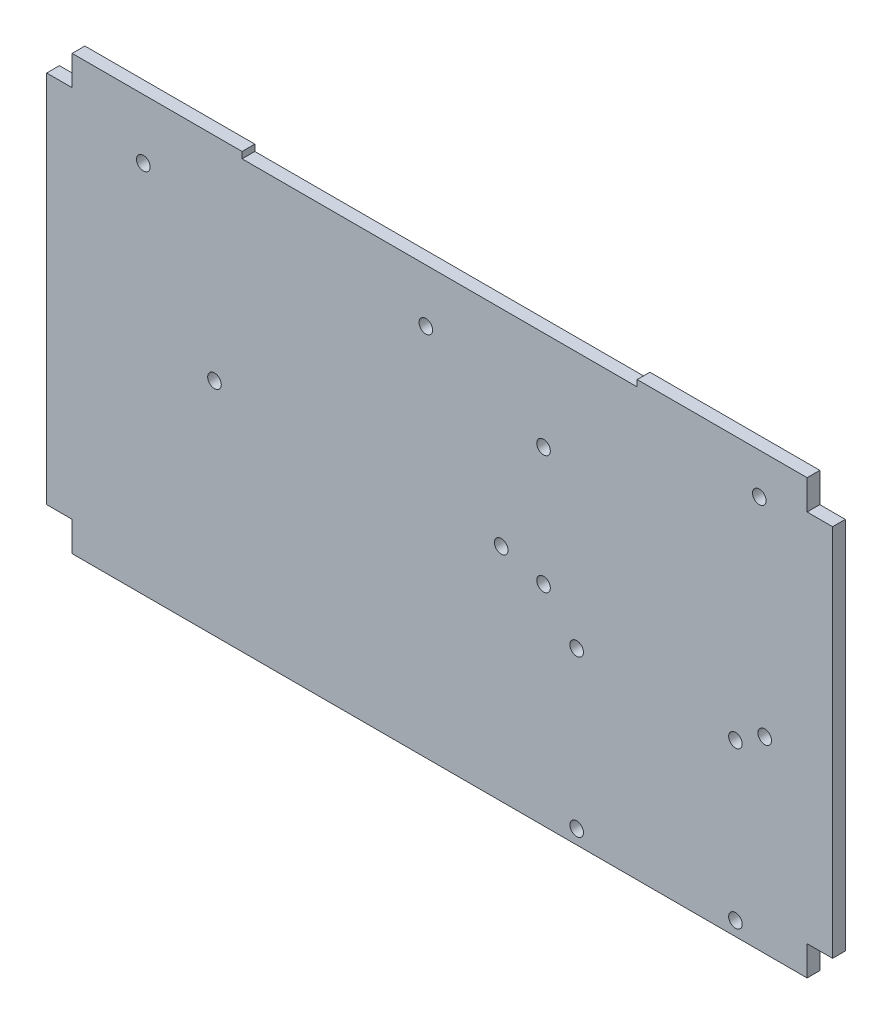
ISO-10303-21;
HEADER;
FILE_DESCRIPTION(('STEP AP214'),'2;1');
FILE_NAME('part.step','',(''),(''),'','','');
FILE_SCHEMA(('AUTOMOTIVE_DESIGN { 1 0 10303 214 1 1 1 1 }'));
ENDSEC;
DATA;
#1=APPLICATION_CONTEXT('core data for automotive mechanical design processes');
#2=APPLICATION_PROTOCOL_DEFINITION('international standard','automotive_design',2000,#1);
#3=PRODUCT_CONTEXT('',#1,'mechanical');
#4=PRODUCT('Part','Part','',(#3));
#5=PRODUCT_RELATED_PRODUCT_CATEGORY('part','',(#4));
#6=PRODUCT_DEFINITION_FORMATION('','',#4);
#7=PRODUCT_DEFINITION_CONTEXT('part definition',#1,'design');
#8=PRODUCT_DEFINITION('design','',#6,#7);
#9=PRODUCT_DEFINITION_SHAPE('','',#8);
#10=(LENGTH_UNIT() NAMED_UNIT(*) SI_UNIT(.MILLI.,.METRE.));
#11=(NAMED_UNIT(*) PLANE_ANGLE_UNIT() SI_UNIT($,.RADIAN.));
#12=(NAMED_UNIT(*) SI_UNIT($,.STERADIAN.) SOLID_ANGLE_UNIT());
#13=UNCERTAINTY_MEASURE_WITH_UNIT(LENGTH_MEASURE(1.E-05),#10,'distance_accuracy_value','');
#14=(GEOMETRIC_REPRESENTATION_CONTEXT(3) GLOBAL_UNCERTAINTY_ASSIGNED_CONTEXT((#13)) GLOBAL_UNIT_ASSIGNED_CONTEXT((#10,
#11,#12)) REPRESENTATION_CONTEXT('',''));
#15=CARTESIAN_POINT('',(0.,0.,0.));
#16=DIRECTION('',(0.,0.,1.));
#17=DIRECTION('',(1.,0.,0.));
#18=AXIS2_PLACEMENT_3D('',#15,#16,#17);
#19=CARTESIAN_POINT('',(92.5,51.,3.));
#20=DIRECTION('',(0.,-1.,0.));
#21=DIRECTION('',(1.,0.,0.));
#22=AXIS2_PLACEMENT_3D('',#19,#20,#21);
#23=PLANE('',#22);
#24=DIRECTION('',(0.,0.,-1.));
#25=VECTOR('',#24,1.);
#26=CARTESIAN_POINT('',(-46.5,51.,3.));
#27=LINE('',#26,#25);
#28=CARTESIAN_POINT('',(-46.5,51.,3.));
#29=VERTEX_POINT('',#28);
#30=CARTESIAN_POINT('',(-46.5,51.,0.));
#31=VERTEX_POINT('',#30);
#32=EDGE_CURVE('E484',#29,#31,#27,.T.);
#33=ORIENTED_EDGE('',*,*,#32,.T.);
#34=DIRECTION('',(-1.,0.,0.));
#35=VECTOR('',#34,1.);
#36=CARTESIAN_POINT('',(92.5,51.,0.));
#37=LINE('',#36,#35);
#38=CARTESIAN_POINT('',(-86.5,51.,0.));
#39=VERTEX_POINT('',#38);
#40=EDGE_CURVE('E199',#31,#39,#37,.T.);
#41=ORIENTED_EDGE('',*,*,#40,.T.);
#42=DIRECTION('',(0.,0.,-1.));
#43=VECTOR('',#42,1.);
#44=CARTESIAN_POINT('',(-86.5,51.,3.));
#45=LINE('',#44,#43);
#46=CARTESIAN_POINT('',(-86.5,51.,3.));
#47=VERTEX_POINT('',#46);
#48=EDGE_CURVE('E288',#47,#39,#45,.T.);
#49=ORIENTED_EDGE('',*,*,#48,.F.);
#50=DIRECTION('',(-1.,0.,0.));
#51=VECTOR('',#50,1.);
#52=CARTESIAN_POINT('',(92.5,51.,3.));
#53=LINE('',#52,#51);
#54=EDGE_CURVE('E244',#29,#47,#53,.T.);
#55=ORIENTED_EDGE('',*,*,#54,.F.);
#56=EDGE_LOOP('',(#33,#41,#49,#55));
#57=FACE_BOUND('',#56,.T.);
#58=ADVANCED_FACE('F37',(#57),#23,.F.);
#59=CARTESIAN_POINT('',(89.75,-47.5,0.));
#60=DIRECTION('',(0.,0.,1.));
#61=DIRECTION('',(1.,0.,0.));
#62=AXIS2_PLACEMENT_3D('',#59,#60,#61);
#63=PLANE('',#62);
#64=DIRECTION('',(-1.,0.,0.));
#65=VECTOR('',#64,1.);
#66=CARTESIAN_POINT('',(46.5,49.5,0.));
#67=LINE('',#66,#65);
#68=CARTESIAN_POINT('',(46.5,49.5,0.));
#69=VERTEX_POINT('',#68);
#70=CARTESIAN_POINT('',(-46.5,49.5,0.));
#71=VERTEX_POINT('',#70);
#72=EDGE_CURVE('E174',#69,#71,#67,.T.);
#73=ORIENTED_EDGE('',*,*,#72,.F.);
#74=DIRECTION('',(0.,-1.,0.));
#75=VECTOR('',#74,1.);
#76=CARTESIAN_POINT('',(46.5,51.,0.));
#77=LINE('',#76,#75);
#78=CARTESIAN_POINT('',(46.5,51.,0.));
#79=VERTEX_POINT('',#78);
#80=EDGE_CURVE('E155',#79,#69,#77,.T.);
#81=ORIENTED_EDGE('',*,*,#80,.F.);
#82=CARTESIAN_POINT('',(86.5,51.,0.));
#83=VERTEX_POINT('',#82);
#84=EDGE_CURVE('E193',#83,#79,#37,.T.);
#85=ORIENTED_EDGE('',*,*,#84,.F.);
#86=DIRECTION('',(0.,1.,0.));
#87=VECTOR('',#86,1.);
#88=CARTESIAN_POINT('',(86.5,51.,0.));
#89=LINE('',#88,#87);
#90=CARTESIAN_POINT('',(86.5,44.,0.));
#91=VERTEX_POINT('',#90);
#92=EDGE_CURVE('E321',#91,#83,#89,.T.);
#93=ORIENTED_EDGE('',*,*,#92,.F.);
#94=DIRECTION('',(-1.,0.,0.));
#95=VECTOR('',#94,1.);
#96=CARTESIAN_POINT('',(93.,44.,0.));
#97=LINE('',#96,#95);
#98=CARTESIAN_POINT('',(92.5,44.,0.));
#99=VERTEX_POINT('',#98);
#100=EDGE_CURVE('E318',#99,#91,#97,.T.);
#101=ORIENTED_EDGE('',*,*,#100,.F.);
#102=DIRECTION('',(0.,1.,0.));
#103=VECTOR('',#102,1.);
#104=CARTESIAN_POINT('',(92.5,-46.3010421191718,0.));
#105=LINE('',#104,#103);
#106=CARTESIAN_POINT('',(92.5,-44.,0.));
#107=VERTEX_POINT('',#106);
#108=EDGE_CURVE('E200',#107,#99,#105,.T.);
#109=ORIENTED_EDGE('',*,*,#108,.F.);
#110=DIRECTION('',(1.,0.,0.));
#111=VECTOR('',#110,1.);
#112=CARTESIAN_POINT('',(93.,-44.,0.));
#113=LINE('',#112,#111);
#114=CARTESIAN_POINT('',(86.5,-44.,0.));
#115=VERTEX_POINT('',#114);
#116=EDGE_CURVE('E304',#115,#107,#113,.T.);
#117=ORIENTED_EDGE('',*,*,#116,.F.);
#118=DIRECTION('',(0.,1.,0.));
#119=VECTOR('',#118,1.);
#120=CARTESIAN_POINT('',(86.5,-51.,0.));
#121=LINE('',#120,#119);
#122=CARTESIAN_POINT('',(86.5,-51.,0.));
#123=VERTEX_POINT('',#122);
#124=EDGE_CURVE('E307',#123,#115,#121,.T.);
#125=ORIENTED_EDGE('',*,*,#124,.F.);
#126=DIRECTION('',(1.,0.,0.));
#127=VECTOR('',#126,1.);
#128=CARTESIAN_POINT('',(-92.5,-51.,0.));
#129=LINE('',#128,#127);
#130=CARTESIAN_POINT('',(-86.5,-51.,0.));
#131=VERTEX_POINT('',#130);
#132=EDGE_CURVE('E238',#131,#123,#129,.T.);
#133=ORIENTED_EDGE('',*,*,#132,.F.);
#134=DIRECTION('',(0.,-1.,0.));
#135=VECTOR('',#134,1.);
#136=CARTESIAN_POINT('',(-86.5,-51.,0.));
#137=LINE('',#136,#135);
#138=CARTESIAN_POINT('',(-86.5,-44.,0.));
#139=VERTEX_POINT('',#138);
#140=EDGE_CURVE('E263',#139,#131,#137,.T.);
#141=ORIENTED_EDGE('',*,*,#140,.F.);
#142=DIRECTION('',(1.,0.,0.));
#143=VECTOR('',#142,1.);
#144=CARTESIAN_POINT('',(-93.,-44.,0.));
#145=LINE('',#144,#143);
#146=CARTESIAN_POINT('',(-92.5,-44.,0.));
#147=VERTEX_POINT('',#146);
#148=EDGE_CURVE('E267',#147,#139,#145,.T.);
#149=ORIENTED_EDGE('',*,*,#148,.F.);
#150=DIRECTION('',(0.,-1.,0.));
#151=VECTOR('',#150,1.);
#152=CARTESIAN_POINT('',(-92.5,46.3010421191718,0.));
#153=LINE('',#152,#151);
#154=CARTESIAN_POINT('',(-92.5,44.,0.));
#155=VERTEX_POINT('',#154);
#156=EDGE_CURVE('E198',#155,#147,#153,.T.);
#157=ORIENTED_EDGE('',*,*,#156,.F.);
#158=DIRECTION('',(-1.,0.,0.));
#159=VECTOR('',#158,1.);
#160=CARTESIAN_POINT('',(-93.,44.,0.));
#161=LINE('',#160,#159);
#162=CARTESIAN_POINT('',(-86.5,44.,0.));
#163=VERTEX_POINT('',#162);
#164=EDGE_CURVE('E276',#163,#155,#161,.T.);
#165=ORIENTED_EDGE('',*,*,#164,.F.);
#166=DIRECTION('',(0.,-1.,0.));
#167=VECTOR('',#166,1.);
#168=CARTESIAN_POINT('',(-86.5,51.,0.));
#169=LINE('',#168,#167);
#170=EDGE_CURVE('E280',#39,#163,#169,.T.);
#171=ORIENTED_EDGE('',*,*,#170,.F.);
#172=ORIENTED_EDGE('',*,*,#40,.F.);
#173=DIRECTION('',(0.,-1.,0.));
#174=VECTOR('',#173,1.);
#175=CARTESIAN_POINT('',(-46.5,51.,0.));
#176=LINE('',#175,#174);
#177=EDGE_CURVE('E171',#31,#71,#176,.T.);
#178=ORIENTED_EDGE('',*,*,#177,.T.);
#179=EDGE_LOOP('',(#73,#81,#85,#93,#101,#109,#117,#125,#133,#141,#149,#157,#165,#171,#172,#178));
#180=FACE_BOUND('',#179,.T.);
#181=CARTESIAN_POINT('',(-69.75,37.,0.));
#182=DIRECTION('',(0.,0.,-1.));
#183=DIRECTION('',(-1.,0.,0.));
#184=AXIS2_PLACEMENT_3D('',#181,#182,#183);
#185=CIRCLE('',#184,1.6);
#186=CARTESIAN_POINT('',(-71.35,37.,0.));
#187=VERTEX_POINT('',#186);
#188=EDGE_CURVE('E228',#187,#187,#185,.T.);
#189=ORIENTED_EDGE('',*,*,#188,.F.);
#190=EDGE_LOOP('',(#189));
#191=FACE_BOUND('',#190,.T.);
#192=CARTESIAN_POINT('',(-3.24999999999998,37.,0.));
#193=DIRECTION('',(0.,0.,-1.));
#194=DIRECTION('',(-1.,0.,0.));
#195=AXIS2_PLACEMENT_3D('',#192,#193,#194);
#196=CIRCLE('',#195,1.6);
#197=CARTESIAN_POINT('',(-4.84999999999998,37.,0.));
#198=VERTEX_POINT('',#197);
#199=EDGE_CURVE('E426',#198,#198,#196,.T.);
#200=ORIENTED_EDGE('',*,*,#199,.F.);
#201=EDGE_LOOP('',(#200));
#202=FACE_BOUND('',#201,.T.);
#203=CARTESIAN_POINT('',(-53.,0.999999999999994,0.));
#204=DIRECTION('',(0.,0.,-1.));
#205=DIRECTION('',(-1.,0.,0.));
#206=AXIS2_PLACEMENT_3D('',#203,#204,#205);
#207=CIRCLE('',#206,1.6);
#208=CARTESIAN_POINT('',(-54.6,0.999999999999994,0.));
#209=VERTEX_POINT('',#208);
#210=EDGE_CURVE('E420',#209,#209,#207,.T.);
#211=ORIENTED_EDGE('',*,*,#210,.F.);
#212=EDGE_LOOP('',(#211));
#213=FACE_BOUND('',#212,.T.);
#214=CARTESIAN_POINT('',(14.5,0.999999999999994,0.));
#215=DIRECTION('',(0.,0.,-1.));
#216=DIRECTION('',(-1.,0.,0.));
#217=AXIS2_PLACEMENT_3D('',#214,#215,#216);
#218=CIRCLE('',#217,1.6);
#219=CARTESIAN_POINT('',(12.9,0.999999999999994,0.));
#220=VERTEX_POINT('',#219);
#221=EDGE_CURVE('E413',#220,#220,#218,.T.);
#222=ORIENTED_EDGE('',*,*,#221,.F.);
#223=EDGE_LOOP('',(#222));
#224=FACE_BOUND('',#223,.T.);
#225=CARTESIAN_POINT('',(32.25681239,-47.68571173,0.));
#226=DIRECTION('',(0.,0.,-1.));
#227=DIRECTION('',(-1.,0.,0.));
#228=AXIS2_PLACEMENT_3D('',#225,#226,#227);
#229=CIRCLE('',#228,1.6);
#230=CARTESIAN_POINT('',(30.65681239,-47.68571173,0.));
#231=VERTEX_POINT('',#230);
#232=EDGE_CURVE('E405',#231,#231,#229,.T.);
#233=ORIENTED_EDGE('',*,*,#232,.F.);
#234=EDGE_LOOP('',(#233));
#235=FACE_BOUND('',#234,.T.);
#236=CARTESIAN_POINT('',(32.25681239,-10.94391141,0.));
#237=DIRECTION('',(0.,0.,-1.));
#238=DIRECTION('',(-1.,0.,0.));
#239=AXIS2_PLACEMENT_3D('',#236,#237,#238);
#240=CIRCLE('',#239,1.6);
#241=CARTESIAN_POINT('',(30.65681239,-10.94391141,0.));
#242=VERTEX_POINT('',#241);
#243=EDGE_CURVE('E394',#242,#242,#240,.T.);
#244=ORIENTED_EDGE('',*,*,#243,.F.);
#245=EDGE_LOOP('',(#244));
#246=FACE_BOUND('',#245,.T.);
#247=CARTESIAN_POINT('',(69.63631327,-10.94391141,0.));
#248=DIRECTION('',(0.,0.,-1.));
#249=DIRECTION('',(-1.,0.,0.));
#250=AXIS2_PLACEMENT_3D('',#247,#248,#249);
#251=CIRCLE('',#250,1.6);
#252=CARTESIAN_POINT('',(68.03631327,-10.94391141,0.));
#253=VERTEX_POINT('',#252);
#254=EDGE_CURVE('E387',#253,#253,#251,.T.);
#255=ORIENTED_EDGE('',*,*,#254,.F.);
#256=EDGE_LOOP('',(#255));
#257=FACE_BOUND('',#256,.T.);
#258=CARTESIAN_POINT('',(69.63631327,-47.68571173,0.));
#259=DIRECTION('',(0.,0.,-1.));
#260=DIRECTION('',(-1.,0.,0.));
#261=AXIS2_PLACEMENT_3D('',#258,#259,#260);
#262=CIRCLE('',#261,1.6);
#263=CARTESIAN_POINT('',(68.03631327,-47.68571173,0.));
#264=VERTEX_POINT('',#263);
#265=EDGE_CURVE('E377',#264,#264,#262,.T.);
#266=ORIENTED_EDGE('',*,*,#265,.F.);
#267=EDGE_LOOP('',(#266));
#268=FACE_BOUND('',#267,.T.);
#269=CARTESIAN_POINT('',(75.26,41.46,0.));
#270=DIRECTION('',(0.,0.,-1.));
#271=DIRECTION('',(-1.,0.,0.));
#272=AXIS2_PLACEMENT_3D('',#269,#270,#271);
#273=CIRCLE('',#272,1.6);
#274=CARTESIAN_POINT('',(73.66,41.46,0.));
#275=VERTEX_POINT('',#274);
#276=EDGE_CURVE('E366',#275,#275,#273,.T.);
#277=ORIENTED_EDGE('',*,*,#276,.F.);
#278=EDGE_LOOP('',(#277));
#279=FACE_BOUND('',#278,.T.);
#280=CARTESIAN_POINT('',(24.46,26.22,0.));
#281=DIRECTION('',(0.,0.,-1.));
#282=DIRECTION('',(-1.,0.,0.));
#283=AXIS2_PLACEMENT_3D('',#280,#281,#282);
#284=CIRCLE('',#283,1.6);
#285=CARTESIAN_POINT('',(22.86,26.22,0.));
#286=VERTEX_POINT('',#285);
#287=EDGE_CURVE('E359',#286,#286,#284,.T.);
#288=ORIENTED_EDGE('',*,*,#287,.F.);
#289=EDGE_LOOP('',(#288));
#290=FACE_BOUND('',#289,.T.);
#291=CARTESIAN_POINT('',(24.46,-1.72000000000002,0.));
#292=DIRECTION('',(0.,0.,-1.));
#293=DIRECTION('',(-1.,0.,0.));
#294=AXIS2_PLACEMENT_3D('',#291,#292,#293);
#295=CIRCLE('',#294,1.6);
#296=CARTESIAN_POINT('',(22.86,-1.72000000000002,0.));
#297=VERTEX_POINT('',#296);
#298=EDGE_CURVE('E349',#297,#297,#295,.T.);
#299=ORIENTED_EDGE('',*,*,#298,.F.);
#300=EDGE_LOOP('',(#299));
#301=FACE_BOUND('',#300,.T.);
#302=CARTESIAN_POINT('',(76.53,-6.80000000000001,0.));
#303=DIRECTION('',(0.,0.,-1.));
#304=DIRECTION('',(-1.,0.,0.));
#305=AXIS2_PLACEMENT_3D('',#302,#303,#304);
#306=CIRCLE('',#305,1.6);
#307=CARTESIAN_POINT('',(74.93,-6.80000000000001,0.));
#308=VERTEX_POINT('',#307);
#309=EDGE_CURVE('E338',#308,#308,#306,.T.);
#310=ORIENTED_EDGE('',*,*,#309,.F.);
#311=EDGE_LOOP('',(#310));
#312=FACE_BOUND('',#311,.T.);
#313=ADVANCED_FACE('F456',(#180,#191,#202,#213,#224,#235,#246,#257,#268,#279,#290,#301,#312),
#63,.F.);
#314=CARTESIAN_POINT('',(-92.5,-51.,3.));
#315=DIRECTION('',(0.,1.,0.));
#316=DIRECTION('',(-1.,0.,0.));
#317=AXIS2_PLACEMENT_3D('',#314,#315,#316);
#318=PLANE('',#317);
#319=DIRECTION('',(1.,0.,0.));
#320=VECTOR('',#319,1.);
#321=CARTESIAN_POINT('',(-92.5,-51.,3.));
#322=LINE('',#321,#320);
#323=CARTESIAN_POINT('',(-86.5,-51.,3.));
#324=VERTEX_POINT('',#323);
#325=CARTESIAN_POINT('',(86.5,-51.,3.));
#326=VERTEX_POINT('',#325);
#327=EDGE_CURVE('E239',#324,#326,#322,.T.);
#328=ORIENTED_EDGE('',*,*,#327,.F.);
#329=DIRECTION('',(0.,0.,-1.));
#330=VECTOR('',#329,1.);
#331=CARTESIAN_POINT('',(-86.5,-51.,3.));
#332=LINE('',#331,#330);
#333=EDGE_CURVE('E270',#324,#131,#332,.T.);
#334=ORIENTED_EDGE('',*,*,#333,.T.);
#335=ORIENTED_EDGE('',*,*,#132,.T.);
#336=DIRECTION('',(0.,0.,-1.));
#337=VECTOR('',#336,1.);
#338=CARTESIAN_POINT('',(86.5,-51.,3.));
#339=LINE('',#338,#337);
#340=EDGE_CURVE('E306',#326,#123,#339,.T.);
#341=ORIENTED_EDGE('',*,*,#340,.F.);
#342=EDGE_LOOP('',(#328,#334,#335,#341));
#343=FACE_BOUND('',#342,.T.);
#344=ADVANCED_FACE('F39',(#343),#318,.F.);
#345=CARTESIAN_POINT('',(92.5,-46.3010421191718,3.));
#346=DIRECTION('',(-1.,0.,0.));
#347=DIRECTION('',(0.,0.,1.));
#348=AXIS2_PLACEMENT_3D('',#345,#346,#347);
#349=PLANE('',#348);
#350=DIRECTION('',(0.,1.,0.));
#351=VECTOR('',#350,1.);
#352=CARTESIAN_POINT('',(92.5,-46.3010421191718,3.));
#353=LINE('',#352,#351);
#354=CARTESIAN_POINT('',(92.5,-44.,3.));
#355=VERTEX_POINT('',#354);
#356=CARTESIAN_POINT('',(92.5,44.,3.));
#357=VERTEX_POINT('',#356);
#358=EDGE_CURVE('E242',#355,#357,#353,.T.);
#359=ORIENTED_EDGE('',*,*,#358,.F.);
#360=DIRECTION('',(0.,0.,-1.));
#361=VECTOR('',#360,1.);
#362=CARTESIAN_POINT('',(92.5,-44.,3.));
#363=LINE('',#362,#361);
#364=EDGE_CURVE('E287',#355,#107,#363,.T.);
#365=ORIENTED_EDGE('',*,*,#364,.T.);
#366=ORIENTED_EDGE('',*,*,#108,.T.);
#367=DIRECTION('',(0.,0.,1.));
#368=VECTOR('',#367,1.);
#369=CARTESIAN_POINT('',(92.5,44.,3.));
#370=LINE('',#369,#368);
#371=EDGE_CURVE('E333',#99,#357,#370,.T.);
#372=ORIENTED_EDGE('',*,*,#371,.T.);
#373=EDGE_LOOP('',(#359,#365,#366,#372));
#374=FACE_BOUND('',#373,.T.);
#375=ADVANCED_FACE('F468',(#374),#349,.F.);
#376=ORIENTED_EDGE('',*,*,#84,.T.);
#377=DIRECTION('',(0.,0.,-1.));
#378=VECTOR('',#377,1.);
#379=CARTESIAN_POINT('',(46.5,51.,3.));
#380=LINE('',#379,#378);
#381=CARTESIAN_POINT('',(46.5,51.,3.));
#382=VERTEX_POINT('',#381);
#383=EDGE_CURVE('E219',#382,#79,#380,.T.);
#384=ORIENTED_EDGE('',*,*,#383,.F.);
#385=CARTESIAN_POINT('',(86.5,51.,3.));
#386=VERTEX_POINT('',#385);
#387=EDGE_CURVE('E170',#386,#382,#53,.T.);
#388=ORIENTED_EDGE('',*,*,#387,.F.);
#389=DIRECTION('',(0.,0.,-1.));
#390=VECTOR('',#389,1.);
#391=CARTESIAN_POINT('',(86.5,51.,3.));
#392=LINE('',#391,#390);
#393=EDGE_CURVE('E329',#386,#83,#392,.T.);
#394=ORIENTED_EDGE('',*,*,#393,.T.);
#395=EDGE_LOOP('',(#376,#384,#388,#394));
#396=FACE_BOUND('',#395,.T.);
#397=ADVANCED_FACE('F459',(#396),#23,.F.);
#398=CARTESIAN_POINT('',(-92.5,46.3010421191718,3.));
#399=DIRECTION('',(1.,0.,0.));
#400=DIRECTION('',(0.,0.,-1.));
#401=AXIS2_PLACEMENT_3D('',#398,#399,#400);
#402=PLANE('',#401);
#403=DIRECTION('',(0.,-1.,0.));
#404=VECTOR('',#403,1.);
#405=CARTESIAN_POINT('',(-92.5,46.3010421191718,3.));
#406=LINE('',#405,#404);
#407=CARTESIAN_POINT('',(-92.5,44.,3.));
#408=VERTEX_POINT('',#407);
#409=CARTESIAN_POINT('',(-92.5,-44.,3.));
#410=VERTEX_POINT('',#409);
#411=EDGE_CURVE('E246',#408,#410,#406,.T.);
#412=ORIENTED_EDGE('',*,*,#411,.F.);
#413=DIRECTION('',(0.,0.,-1.));
#414=VECTOR('',#413,1.);
#415=CARTESIAN_POINT('',(-92.5,44.,3.));
#416=LINE('',#415,#414);
#417=EDGE_CURVE('E322',#408,#155,#416,.T.);
#418=ORIENTED_EDGE('',*,*,#417,.T.);
#419=ORIENTED_EDGE('',*,*,#156,.T.);
#420=DIRECTION('',(0.,0.,1.));
#421=VECTOR('',#420,1.);
#422=CARTESIAN_POINT('',(-92.5,-44.,3.));
#423=LINE('',#422,#421);
#424=EDGE_CURVE('E496',#147,#410,#423,.T.);
#425=ORIENTED_EDGE('',*,*,#424,.T.);
#426=EDGE_LOOP('',(#412,#418,#419,#425));
#427=FACE_BOUND('',#426,.T.);
#428=ADVANCED_FACE('F441',(#427),#402,.F.);
#429=CARTESIAN_POINT('',(89.75,-47.5,3.));
#430=DIRECTION('',(0.,0.,1.));
#431=DIRECTION('',(1.,0.,0.));
#432=AXIS2_PLACEMENT_3D('',#429,#430,#431);
#433=PLANE('',#432);
#434=DIRECTION('',(0.,-1.,0.));
#435=VECTOR('',#434,1.);
#436=CARTESIAN_POINT('',(46.5,51.,3.));
#437=LINE('',#436,#435);
#438=CARTESIAN_POINT('',(46.5,49.5,3.));
#439=VERTEX_POINT('',#438);
#440=EDGE_CURVE('E152',#382,#439,#437,.T.);
#441=ORIENTED_EDGE('',*,*,#440,.T.);
#442=DIRECTION('',(-1.,0.,0.));
#443=VECTOR('',#442,1.);
#444=CARTESIAN_POINT('',(46.5,49.5,3.));
#445=LINE('',#444,#443);
#446=CARTESIAN_POINT('',(-46.5,49.5,3.));
#447=VERTEX_POINT('',#446);
#448=EDGE_CURVE('E160',#439,#447,#445,.T.);
#449=ORIENTED_EDGE('',*,*,#448,.T.);
#450=DIRECTION('',(0.,-1.,0.));
#451=VECTOR('',#450,1.);
#452=CARTESIAN_POINT('',(-46.5,51.,3.));
#453=LINE('',#452,#451);
#454=EDGE_CURVE('E157',#29,#447,#453,.T.);
#455=ORIENTED_EDGE('',*,*,#454,.F.);
#456=ORIENTED_EDGE('',*,*,#54,.T.);
#457=DIRECTION('',(0.,-1.,0.));
#458=VECTOR('',#457,1.);
#459=CARTESIAN_POINT('',(-86.5,51.,3.));
#460=LINE('',#459,#458);
#461=CARTESIAN_POINT('',(-86.5,44.,3.));
#462=VERTEX_POINT('',#461);
#463=EDGE_CURVE('E279',#47,#462,#460,.T.);
#464=ORIENTED_EDGE('',*,*,#463,.T.);
#465=DIRECTION('',(-1.,0.,0.));
#466=VECTOR('',#465,1.);
#467=CARTESIAN_POINT('',(-93.,44.,3.));
#468=LINE('',#467,#466);
#469=EDGE_CURVE('E60',#462,#408,#468,.T.);
#470=ORIENTED_EDGE('',*,*,#469,.T.);
#471=ORIENTED_EDGE('',*,*,#411,.T.);
#472=DIRECTION('',(-1.,0.,0.));
#473=VECTOR('',#472,1.);
#474=CARTESIAN_POINT('',(89.75,-44.,3.));
#475=LINE('',#474,#473);
#476=CARTESIAN_POINT('',(-86.5,-44.,3.));
#477=VERTEX_POINT('',#476);
#478=EDGE_CURVE('E12',#477,#410,#475,.T.);
#479=ORIENTED_EDGE('',*,*,#478,.F.);
#480=DIRECTION('',(0.,-1.,0.));
#481=VECTOR('',#480,1.);
#482=CARTESIAN_POINT('',(-86.5,-51.,3.));
#483=LINE('',#482,#481);
#484=EDGE_CURVE('E266',#477,#324,#483,.T.);
#485=ORIENTED_EDGE('',*,*,#484,.T.);
#486=ORIENTED_EDGE('',*,*,#327,.T.);
#487=DIRECTION('',(0.,1.,0.));
#488=VECTOR('',#487,1.);
#489=CARTESIAN_POINT('',(86.5,-51.,3.));
#490=LINE('',#489,#488);
#491=CARTESIAN_POINT('',(86.5,-44.,3.));
#492=VERTEX_POINT('',#491);
#493=EDGE_CURVE('E300',#326,#492,#490,.T.);
#494=ORIENTED_EDGE('',*,*,#493,.T.);
#495=DIRECTION('',(1.,0.,0.));
#496=VECTOR('',#495,1.);
#497=CARTESIAN_POINT('',(93.,-44.,3.));
#498=LINE('',#497,#496);
#499=EDGE_CURVE('E303',#492,#355,#498,.T.);
#500=ORIENTED_EDGE('',*,*,#499,.T.);
#501=ORIENTED_EDGE('',*,*,#358,.T.);
#502=DIRECTION('',(1.,0.,0.));
#503=VECTOR('',#502,1.);
#504=CARTESIAN_POINT('',(89.75,44.,3.));
#505=LINE('',#504,#503);
#506=CARTESIAN_POINT('',(86.5,44.,3.));
#507=VERTEX_POINT('',#506);
#508=EDGE_CURVE('E45',#507,#357,#505,.T.);
#509=ORIENTED_EDGE('',*,*,#508,.F.);
#510=DIRECTION('',(0.,1.,0.));
#511=VECTOR('',#510,1.);
#512=CARTESIAN_POINT('',(86.5,51.,3.));
#513=LINE('',#512,#511);
#514=EDGE_CURVE('E323',#507,#386,#513,.T.);
#515=ORIENTED_EDGE('',*,*,#514,.T.);
#516=ORIENTED_EDGE('',*,*,#387,.T.);
#517=EDGE_LOOP('',(#441,#449,#455,#456,#464,#470,#471,#479,#485,#486,#494,#500,#501,#509,#515,#516));
#518=FACE_BOUND('',#517,.T.);
#519=CARTESIAN_POINT('',(76.53,-6.80000000000001,3.));
#520=DIRECTION('',(0.,0.,1.));
#521=DIRECTION('',(1.,0.,0.));
#522=AXIS2_PLACEMENT_3D('',#519,#520,#521);
#523=CIRCLE('',#522,1.6);
#524=CARTESIAN_POINT('',(78.13,-6.80000000000001,3.));
#525=VERTEX_POINT('',#524);
#526=EDGE_CURVE('E342',#525,#525,#523,.T.);
#527=ORIENTED_EDGE('',*,*,#526,.F.);
#528=EDGE_LOOP('',(#527));
#529=FACE_BOUND('',#528,.T.);
#530=CARTESIAN_POINT('',(24.46,-1.72000000000002,3.));
#531=DIRECTION('',(0.,0.,1.));
#532=DIRECTION('',(1.,0.,0.));
#533=AXIS2_PLACEMENT_3D('',#530,#531,#532);
#534=CIRCLE('',#533,1.6);
#535=CARTESIAN_POINT('',(26.06,-1.72000000000002,3.));
#536=VERTEX_POINT('',#535);
#537=EDGE_CURVE('E353',#536,#536,#534,.T.);
#538=ORIENTED_EDGE('',*,*,#537,.F.);
#539=EDGE_LOOP('',(#538));
#540=FACE_BOUND('',#539,.T.);
#541=CARTESIAN_POINT('',(24.46,26.22,3.));
#542=DIRECTION('',(0.,0.,1.));
#543=DIRECTION('',(1.,0.,0.));
#544=AXIS2_PLACEMENT_3D('',#541,#542,#543);
#545=CIRCLE('',#544,1.6);
#546=CARTESIAN_POINT('',(26.06,26.22,3.));
#547=VERTEX_POINT('',#546);
#548=EDGE_CURVE('E363',#547,#547,#545,.T.);
#549=ORIENTED_EDGE('',*,*,#548,.F.);
#550=EDGE_LOOP('',(#549));
#551=FACE_BOUND('',#550,.T.);
#552=CARTESIAN_POINT('',(75.26,41.46,3.));
#553=DIRECTION('',(0.,0.,1.));
#554=DIRECTION('',(1.,0.,0.));
#555=AXIS2_PLACEMENT_3D('',#552,#553,#554);
#556=CIRCLE('',#555,1.6);
#557=CARTESIAN_POINT('',(76.86,41.46,3.));
#558=VERTEX_POINT('',#557);
#559=EDGE_CURVE('E370',#558,#558,#556,.T.);
#560=ORIENTED_EDGE('',*,*,#559,.F.);
#561=EDGE_LOOP('',(#560));
#562=FACE_BOUND('',#561,.T.);
#563=CARTESIAN_POINT('',(69.63631327,-47.68571173,3.));
#564=DIRECTION('',(0.,0.,1.));
#565=DIRECTION('',(1.,0.,0.));
#566=AXIS2_PLACEMENT_3D('',#563,#564,#565);
#567=CIRCLE('',#566,1.6);
#568=CARTESIAN_POINT('',(71.23631327,-47.68571173,3.));
#569=VERTEX_POINT('',#568);
#570=EDGE_CURVE('E381',#569,#569,#567,.T.);
#571=ORIENTED_EDGE('',*,*,#570,.F.);
#572=EDGE_LOOP('',(#571));
#573=FACE_BOUND('',#572,.T.);
#574=CARTESIAN_POINT('',(69.63631327,-10.94391141,3.));
#575=DIRECTION('',(0.,0.,1.));
#576=DIRECTION('',(1.,0.,0.));
#577=AXIS2_PLACEMENT_3D('',#574,#575,#576);
#578=CIRCLE('',#577,1.6);
#579=CARTESIAN_POINT('',(71.23631327,-10.94391141,3.));
#580=VERTEX_POINT('',#579);
#581=EDGE_CURVE('E391',#580,#580,#578,.T.);
#582=ORIENTED_EDGE('',*,*,#581,.F.);
#583=EDGE_LOOP('',(#582));
#584=FACE_BOUND('',#583,.T.);
#585=CARTESIAN_POINT('',(32.25681239,-10.94391141,3.));
#586=DIRECTION('',(0.,0.,1.));
#587=DIRECTION('',(1.,0.,0.));
#588=AXIS2_PLACEMENT_3D('',#585,#586,#587);
#589=CIRCLE('',#588,1.6);
#590=CARTESIAN_POINT('',(33.85681239,-10.94391141,3.));
#591=VERTEX_POINT('',#590);
#592=EDGE_CURVE('E398',#591,#591,#589,.T.);
#593=ORIENTED_EDGE('',*,*,#592,.F.);
#594=EDGE_LOOP('',(#593));
#595=FACE_BOUND('',#594,.T.);
#596=CARTESIAN_POINT('',(32.25681239,-47.68571173,3.));
#597=DIRECTION('',(0.,0.,1.));
#598=DIRECTION('',(1.,0.,0.));
#599=AXIS2_PLACEMENT_3D('',#596,#597,#598);
#600=CIRCLE('',#599,1.6);
#601=CARTESIAN_POINT('',(33.85681239,-47.68571173,3.));
#602=VERTEX_POINT('',#601);
#603=EDGE_CURVE('E409',#602,#602,#600,.T.);
#604=ORIENTED_EDGE('',*,*,#603,.F.);
#605=EDGE_LOOP('',(#604));
#606=FACE_BOUND('',#605,.T.);
#607=CARTESIAN_POINT('',(14.5,0.999999999999994,3.));
#608=DIRECTION('',(0.,0.,1.));
#609=DIRECTION('',(1.,0.,0.));
#610=AXIS2_PLACEMENT_3D('',#607,#608,#609);
#611=CIRCLE('',#610,1.6);
#612=CARTESIAN_POINT('',(16.1,0.999999999999994,3.));
#613=VERTEX_POINT('',#612);
#614=EDGE_CURVE('E417',#613,#613,#611,.T.);
#615=ORIENTED_EDGE('',*,*,#614,.F.);
#616=EDGE_LOOP('',(#615));
#617=FACE_BOUND('',#616,.T.);
#618=CARTESIAN_POINT('',(-53.,0.999999999999994,3.));
#619=DIRECTION('',(0.,0.,1.));
#620=DIRECTION('',(1.,0.,0.));
#621=AXIS2_PLACEMENT_3D('',#618,#619,#620);
#622=CIRCLE('',#621,1.6);
#623=CARTESIAN_POINT('',(-51.4,0.999999999999994,3.));
#624=VERTEX_POINT('',#623);
#625=EDGE_CURVE('E424',#624,#624,#622,.T.);
#626=ORIENTED_EDGE('',*,*,#625,.F.);
#627=EDGE_LOOP('',(#626));
#628=FACE_BOUND('',#627,.T.);
#629=CARTESIAN_POINT('',(-3.24999999999998,37.,3.));
#630=DIRECTION('',(0.,0.,1.));
#631=DIRECTION('',(1.,0.,0.));
#632=AXIS2_PLACEMENT_3D('',#629,#630,#631);
#633=CIRCLE('',#632,1.6);
#634=CARTESIAN_POINT('',(-1.64999999999998,37.,3.));
#635=VERTEX_POINT('',#634);
#636=EDGE_CURVE('E234',#635,#635,#633,.T.);
#637=ORIENTED_EDGE('',*,*,#636,.F.);
#638=EDGE_LOOP('',(#637));
#639=FACE_BOUND('',#638,.T.);
#640=CARTESIAN_POINT('',(-69.75,37.,3.));
#641=DIRECTION('',(0.,0.,1.));
#642=DIRECTION('',(1.,0.,0.));
#643=AXIS2_PLACEMENT_3D('',#640,#641,#642);
#644=CIRCLE('',#643,1.6);
#645=CARTESIAN_POINT('',(-68.15,37.,3.));
#646=VERTEX_POINT('',#645);
#647=EDGE_CURVE('E233',#646,#646,#644,.T.);
#648=ORIENTED_EDGE('',*,*,#647,.F.);
#649=EDGE_LOOP('',(#648));
#650=FACE_BOUND('',#649,.T.);
#651=ADVANCED_FACE('F166',(#518,#529,#540,#551,#562,#573,#584,#595,#606,#617,#628,#639,#650),
#433,.T.);
#652=CARTESIAN_POINT('',(-69.75,37.,0.));
#653=DIRECTION('',(0.,0.,-1.));
#654=DIRECTION('',(-1.,0.,0.));
#655=AXIS2_PLACEMENT_3D('',#652,#653,#654);
#656=CYLINDRICAL_SURFACE('',#655,1.6);
#657=ORIENTED_EDGE('',*,*,#188,.T.);
#658=EDGE_LOOP('',(#657));
#659=FACE_BOUND('',#658,.T.);
#660=ORIENTED_EDGE('',*,*,#647,.T.);
#661=EDGE_LOOP('',(#660));
#662=FACE_BOUND('',#661,.T.);
#663=ADVANCED_FACE('F440',(#659,#662),#656,.F.);
#664=CARTESIAN_POINT('',(-3.24999999999998,37.,0.));
#665=DIRECTION('',(0.,0.,-1.));
#666=DIRECTION('',(-1.,0.,0.));
#667=AXIS2_PLACEMENT_3D('',#664,#665,#666);
#668=CYLINDRICAL_SURFACE('',#667,1.6);
#669=ORIENTED_EDGE('',*,*,#199,.T.);
#670=EDGE_LOOP('',(#669));
#671=FACE_BOUND('',#670,.T.);
#672=ORIENTED_EDGE('',*,*,#636,.T.);
#673=EDGE_LOOP('',(#672));
#674=FACE_BOUND('',#673,.T.);
#675=ADVANCED_FACE('F448',(#671,#674),#668,.F.);
#676=CARTESIAN_POINT('',(-53.,0.999999999999994,0.));
#677=DIRECTION('',(0.,0.,-1.));
#678=DIRECTION('',(-1.,0.,0.));
#679=AXIS2_PLACEMENT_3D('',#676,#677,#678);
#680=CYLINDRICAL_SURFACE('',#679,1.6);
#681=ORIENTED_EDGE('',*,*,#210,.T.);
#682=EDGE_LOOP('',(#681));
#683=FACE_BOUND('',#682,.T.);
#684=ORIENTED_EDGE('',*,*,#625,.T.);
#685=EDGE_LOOP('',(#684));
#686=FACE_BOUND('',#685,.T.);
#687=ADVANCED_FACE('F436',(#683,#686),#680,.F.);
#688=CARTESIAN_POINT('',(14.5,0.999999999999994,0.));
#689=DIRECTION('',(0.,0.,-1.));
#690=DIRECTION('',(-1.,0.,0.));
#691=AXIS2_PLACEMENT_3D('',#688,#689,#690);
#692=CYLINDRICAL_SURFACE('',#691,1.6);
#693=ORIENTED_EDGE('',*,*,#221,.T.);
#694=EDGE_LOOP('',(#693));
#695=FACE_BOUND('',#694,.T.);
#696=ORIENTED_EDGE('',*,*,#614,.T.);
#697=EDGE_LOOP('',(#696));
#698=FACE_BOUND('',#697,.T.);
#699=ADVANCED_FACE('F568',(#695,#698),#692,.F.);
#700=CARTESIAN_POINT('',(32.25681239,-47.68571173,0.));
#701=DIRECTION('',(0.,0.,-1.));
#702=DIRECTION('',(-1.,0.,0.));
#703=AXIS2_PLACEMENT_3D('',#700,#701,#702);
#704=CYLINDRICAL_SURFACE('',#703,1.6);
#705=ORIENTED_EDGE('',*,*,#232,.T.);
#706=EDGE_LOOP('',(#705));
#707=FACE_BOUND('',#706,.T.);
#708=ORIENTED_EDGE('',*,*,#603,.T.);
#709=EDGE_LOOP('',(#708));
#710=FACE_BOUND('',#709,.T.);
#711=ADVANCED_FACE('F564',(#707,#710),#704,.F.);
#712=CARTESIAN_POINT('',(32.25681239,-10.94391141,0.));
#713=DIRECTION('',(0.,0.,-1.));
#714=DIRECTION('',(-1.,0.,0.));
#715=AXIS2_PLACEMENT_3D('',#712,#713,#714);
#716=CYLINDRICAL_SURFACE('',#715,1.6);
#717=ORIENTED_EDGE('',*,*,#243,.T.);
#718=EDGE_LOOP('',(#717));
#719=FACE_BOUND('',#718,.T.);
#720=ORIENTED_EDGE('',*,*,#592,.T.);
#721=EDGE_LOOP('',(#720));
#722=FACE_BOUND('',#721,.T.);
#723=ADVANCED_FACE('F560',(#719,#722),#716,.F.);
#724=CARTESIAN_POINT('',(69.63631327,-10.94391141,0.));
#725=DIRECTION('',(0.,0.,-1.));
#726=DIRECTION('',(-1.,0.,0.));
#727=AXIS2_PLACEMENT_3D('',#724,#725,#726);
#728=CYLINDRICAL_SURFACE('',#727,1.6);
#729=ORIENTED_EDGE('',*,*,#254,.T.);
#730=EDGE_LOOP('',(#729));
#731=FACE_BOUND('',#730,.T.);
#732=ORIENTED_EDGE('',*,*,#581,.T.);
#733=EDGE_LOOP('',(#732));
#734=FACE_BOUND('',#733,.T.);
#735=ADVANCED_FACE('F556',(#731,#734),#728,.F.);
#736=CARTESIAN_POINT('',(69.63631327,-47.68571173,0.));
#737=DIRECTION('',(0.,0.,-1.));
#738=DIRECTION('',(-1.,0.,0.));
#739=AXIS2_PLACEMENT_3D('',#736,#737,#738);
#740=CYLINDRICAL_SURFACE('',#739,1.6);
#741=ORIENTED_EDGE('',*,*,#265,.T.);
#742=EDGE_LOOP('',(#741));
#743=FACE_BOUND('',#742,.T.);
#744=ORIENTED_EDGE('',*,*,#570,.T.);
#745=EDGE_LOOP('',(#744));
#746=FACE_BOUND('',#745,.T.);
#747=ADVANCED_FACE('F552',(#743,#746),#740,.F.);
#748=CARTESIAN_POINT('',(75.26,41.46,0.));
#749=DIRECTION('',(0.,0.,-1.));
#750=DIRECTION('',(-1.,0.,0.));
#751=AXIS2_PLACEMENT_3D('',#748,#749,#750);
#752=CYLINDRICAL_SURFACE('',#751,1.6);
#753=ORIENTED_EDGE('',*,*,#276,.T.);
#754=EDGE_LOOP('',(#753));
#755=FACE_BOUND('',#754,.T.);
#756=ORIENTED_EDGE('',*,*,#559,.T.);
#757=EDGE_LOOP('',(#756));
#758=FACE_BOUND('',#757,.T.);
#759=ADVANCED_FACE('F548',(#755,#758),#752,.F.);
#760=CARTESIAN_POINT('',(24.46,26.22,0.));
#761=DIRECTION('',(0.,0.,-1.));
#762=DIRECTION('',(-1.,0.,0.));
#763=AXIS2_PLACEMENT_3D('',#760,#761,#762);
#764=CYLINDRICAL_SURFACE('',#763,1.6);
#765=ORIENTED_EDGE('',*,*,#287,.T.);
#766=EDGE_LOOP('',(#765));
#767=FACE_BOUND('',#766,.T.);
#768=ORIENTED_EDGE('',*,*,#548,.T.);
#769=EDGE_LOOP('',(#768));
#770=FACE_BOUND('',#769,.T.);
#771=ADVANCED_FACE('F544',(#767,#770),#764,.F.);
#772=CARTESIAN_POINT('',(24.46,-1.72000000000002,0.));
#773=DIRECTION('',(0.,0.,-1.));
#774=DIRECTION('',(-1.,0.,0.));
#775=AXIS2_PLACEMENT_3D('',#772,#773,#774);
#776=CYLINDRICAL_SURFACE('',#775,1.6);
#777=ORIENTED_EDGE('',*,*,#298,.T.);
#778=EDGE_LOOP('',(#777));
#779=FACE_BOUND('',#778,.T.);
#780=ORIENTED_EDGE('',*,*,#537,.T.);
#781=EDGE_LOOP('',(#780));
#782=FACE_BOUND('',#781,.T.);
#783=ADVANCED_FACE('F540',(#779,#782),#776,.F.);
#784=CARTESIAN_POINT('',(76.53,-6.80000000000001,0.));
#785=DIRECTION('',(0.,0.,-1.));
#786=DIRECTION('',(-1.,0.,0.));
#787=AXIS2_PLACEMENT_3D('',#784,#785,#786);
#788=CYLINDRICAL_SURFACE('',#787,1.6);
#789=ORIENTED_EDGE('',*,*,#309,.T.);
#790=EDGE_LOOP('',(#789));
#791=FACE_BOUND('',#790,.T.);
#792=ORIENTED_EDGE('',*,*,#526,.T.);
#793=EDGE_LOOP('',(#792));
#794=FACE_BOUND('',#793,.T.);
#795=ADVANCED_FACE('F534',(#791,#794),#788,.F.);
#796=CARTESIAN_POINT('',(93.,44.,3.));
#797=DIRECTION('',(0.,-1.,0.));
#798=DIRECTION('',(0.,0.,-1.));
#799=AXIS2_PLACEMENT_3D('',#796,#797,#798);
#800=PLANE('',#799);
#801=ORIENTED_EDGE('',*,*,#100,.T.);
#802=DIRECTION('',(0.,0.,-1.));
#803=VECTOR('',#802,1.);
#804=CARTESIAN_POINT('',(86.5,44.,3.));
#805=LINE('',#804,#803);
#806=EDGE_CURVE('E334',#507,#91,#805,.T.);
#807=ORIENTED_EDGE('',*,*,#806,.F.);
#808=ORIENTED_EDGE('',*,*,#508,.T.);
#809=ORIENTED_EDGE('',*,*,#371,.F.);
#810=EDGE_LOOP('',(#801,#807,#808,#809));
#811=FACE_BOUND('',#810,.T.);
#812=ADVANCED_FACE('F524',(#811),#800,.F.);
#813=CARTESIAN_POINT('',(86.5,51.,3.));
#814=DIRECTION('',(-1.,0.,0.));
#815=DIRECTION('',(0.,0.,1.));
#816=AXIS2_PLACEMENT_3D('',#813,#814,#815);
#817=PLANE('',#816);
#818=ORIENTED_EDGE('',*,*,#92,.T.);
#819=ORIENTED_EDGE('',*,*,#393,.F.);
#820=ORIENTED_EDGE('',*,*,#514,.F.);
#821=ORIENTED_EDGE('',*,*,#806,.T.);
#822=EDGE_LOOP('',(#818,#819,#820,#821));
#823=FACE_BOUND('',#822,.T.);
#824=ADVANCED_FACE('F526',(#823),#817,.F.);
#825=CARTESIAN_POINT('',(93.,-44.,3.));
#826=DIRECTION('',(0.,1.,0.));
#827=DIRECTION('',(-1.,0.,0.));
#828=AXIS2_PLACEMENT_3D('',#825,#826,#827);
#829=PLANE('',#828);
#830=ORIENTED_EDGE('',*,*,#499,.F.);
#831=DIRECTION('',(0.,0.,-1.));
#832=VECTOR('',#831,1.);
#833=CARTESIAN_POINT('',(86.5,-44.,3.));
#834=LINE('',#833,#832);
#835=EDGE_CURVE('E503',#492,#115,#834,.T.);
#836=ORIENTED_EDGE('',*,*,#835,.T.);
#837=ORIENTED_EDGE('',*,*,#116,.T.);
#838=ORIENTED_EDGE('',*,*,#364,.F.);
#839=EDGE_LOOP('',(#830,#836,#837,#838));
#840=FACE_BOUND('',#839,.T.);
#841=ADVANCED_FACE('F518',(#840),#829,.F.);
#842=CARTESIAN_POINT('',(86.5,-51.,3.));
#843=DIRECTION('',(-1.,0.,0.));
#844=DIRECTION('',(0.,0.,1.));
#845=AXIS2_PLACEMENT_3D('',#842,#843,#844);
#846=PLANE('',#845);
#847=ORIENTED_EDGE('',*,*,#124,.T.);
#848=ORIENTED_EDGE('',*,*,#835,.F.);
#849=ORIENTED_EDGE('',*,*,#493,.F.);
#850=ORIENTED_EDGE('',*,*,#340,.T.);
#851=EDGE_LOOP('',(#847,#848,#849,#850));
#852=FACE_BOUND('',#851,.T.);
#853=ADVANCED_FACE('F515',(#852),#846,.F.);
#854=CARTESIAN_POINT('',(-93.,-44.,3.));
#855=DIRECTION('',(0.,1.,0.));
#856=DIRECTION('',(0.,0.,1.));
#857=AXIS2_PLACEMENT_3D('',#854,#855,#856);
#858=PLANE('',#857);
#859=ORIENTED_EDGE('',*,*,#148,.T.);
#860=DIRECTION('',(0.,0.,-1.));
#861=VECTOR('',#860,1.);
#862=CARTESIAN_POINT('',(-86.5,-44.,3.));
#863=LINE('',#862,#861);
#864=EDGE_CURVE('E291',#477,#139,#863,.T.);
#865=ORIENTED_EDGE('',*,*,#864,.F.);
#866=ORIENTED_EDGE('',*,*,#478,.T.);
#867=ORIENTED_EDGE('',*,*,#424,.F.);
#868=EDGE_LOOP('',(#859,#865,#866,#867));
#869=FACE_BOUND('',#868,.T.);
#870=ADVANCED_FACE('F506',(#869),#858,.F.);
#871=CARTESIAN_POINT('',(-86.5,-51.,3.));
#872=DIRECTION('',(1.,0.,0.));
#873=DIRECTION('',(0.,0.,-1.));
#874=AXIS2_PLACEMENT_3D('',#871,#872,#873);
#875=PLANE('',#874);
#876=ORIENTED_EDGE('',*,*,#140,.T.);
#877=ORIENTED_EDGE('',*,*,#333,.F.);
#878=ORIENTED_EDGE('',*,*,#484,.F.);
#879=ORIENTED_EDGE('',*,*,#864,.T.);
#880=EDGE_LOOP('',(#876,#877,#878,#879));
#881=FACE_BOUND('',#880,.T.);
#882=ADVANCED_FACE('F510',(#881),#875,.F.);
#883=CARTESIAN_POINT('',(-93.,44.,3.));
#884=DIRECTION('',(0.,-1.,0.));
#885=DIRECTION('',(0.,0.,-1.));
#886=AXIS2_PLACEMENT_3D('',#883,#884,#885);
#887=PLANE('',#886);
#888=ORIENTED_EDGE('',*,*,#469,.F.);
#889=DIRECTION('',(0.,0.,-1.));
#890=VECTOR('',#889,1.);
#891=CARTESIAN_POINT('',(-86.5,44.,3.));
#892=LINE('',#891,#890);
#893=EDGE_CURVE('E283',#462,#163,#892,.T.);
#894=ORIENTED_EDGE('',*,*,#893,.T.);
#895=ORIENTED_EDGE('',*,*,#164,.T.);
#896=ORIENTED_EDGE('',*,*,#417,.F.);
#897=EDGE_LOOP('',(#888,#894,#895,#896));
#898=FACE_BOUND('',#897,.T.);
#899=ADVANCED_FACE('F710',(#898),#887,.F.);
#900=CARTESIAN_POINT('',(-86.5,51.,3.));
#901=DIRECTION('',(1.,0.,0.));
#902=DIRECTION('',(0.,0.,-1.));
#903=AXIS2_PLACEMENT_3D('',#900,#901,#902);
#904=PLANE('',#903);
#905=ORIENTED_EDGE('',*,*,#170,.T.);
#906=ORIENTED_EDGE('',*,*,#893,.F.);
#907=ORIENTED_EDGE('',*,*,#463,.F.);
#908=ORIENTED_EDGE('',*,*,#48,.T.);
#909=EDGE_LOOP('',(#905,#906,#907,#908));
#910=FACE_BOUND('',#909,.T.);
#911=ADVANCED_FACE('F719',(#910),#904,.F.);
#912=CARTESIAN_POINT('',(46.5,51.,3.));
#913=DIRECTION('',(1.,0.,0.));
#914=DIRECTION('',(0.,0.,-1.));
#915=AXIS2_PLACEMENT_3D('',#912,#913,#914);
#916=PLANE('',#915);
#917=ORIENTED_EDGE('',*,*,#80,.T.);
#918=DIRECTION('',(0.,0.,-1.));
#919=VECTOR('',#918,1.);
#920=CARTESIAN_POINT('',(46.5,49.5,3.));
#921=LINE('',#920,#919);
#922=EDGE_CURVE('E149',#439,#69,#921,.T.);
#923=ORIENTED_EDGE('',*,*,#922,.F.);
#924=ORIENTED_EDGE('',*,*,#440,.F.);
#925=ORIENTED_EDGE('',*,*,#383,.T.);
#926=EDGE_LOOP('',(#917,#923,#924,#925));
#927=FACE_BOUND('',#926,.T.);
#928=ADVANCED_FACE('F150',(#927),#916,.F.);
#929=CARTESIAN_POINT('',(-46.5,51.,3.));
#930=DIRECTION('',(1.,0.,0.));
#931=DIRECTION('',(0.,0.,-1.));
#932=AXIS2_PLACEMENT_3D('',#929,#930,#931);
#933=PLANE('',#932);
#934=ORIENTED_EDGE('',*,*,#177,.F.);
#935=ORIENTED_EDGE('',*,*,#32,.F.);
#936=ORIENTED_EDGE('',*,*,#454,.T.);
#937=DIRECTION('',(0.,0.,-1.));
#938=VECTOR('',#937,1.);
#939=CARTESIAN_POINT('',(-46.5,49.5,3.));
#940=LINE('',#939,#938);
#941=EDGE_CURVE('E52',#447,#71,#940,.T.);
#942=ORIENTED_EDGE('',*,*,#941,.T.);
#943=EDGE_LOOP('',(#934,#935,#936,#942));
#944=FACE_BOUND('',#943,.T.);
#945=ADVANCED_FACE('F483',(#944),#933,.T.);
#946=CARTESIAN_POINT('',(46.5,49.5,3.));
#947=DIRECTION('',(0.,-1.,0.));
#948=DIRECTION('',(0.,0.,-1.));
#949=AXIS2_PLACEMENT_3D('',#946,#947,#948);
#950=PLANE('',#949);
#951=ORIENTED_EDGE('',*,*,#72,.T.);
#952=ORIENTED_EDGE('',*,*,#941,.F.);
#953=ORIENTED_EDGE('',*,*,#448,.F.);
#954=ORIENTED_EDGE('',*,*,#922,.T.);
#955=EDGE_LOOP('',(#951,#952,#953,#954));
#956=FACE_BOUND('',#955,.T.);
#957=ADVANCED_FACE('F161',(#956),#950,.F.);
#958=CLOSED_SHELL('',(#58,#313,#344,#375,#397,#428,#651,#663,#675,#687,#699,#711,#723,#735,#747,
#759,#771,#783,#795,#812,#824,#841,#853,#870,#882,#899,#911,#928,#945,#957));
#959=MANIFOLD_SOLID_BREP('B2',#958);
#960=ADVANCED_BREP_SHAPE_REPRESENTATION('',(#18,#959),#14);
#961=SHAPE_DEFINITION_REPRESENTATION(#9,#960);
ENDSEC;
END-ISO-10303-21;
